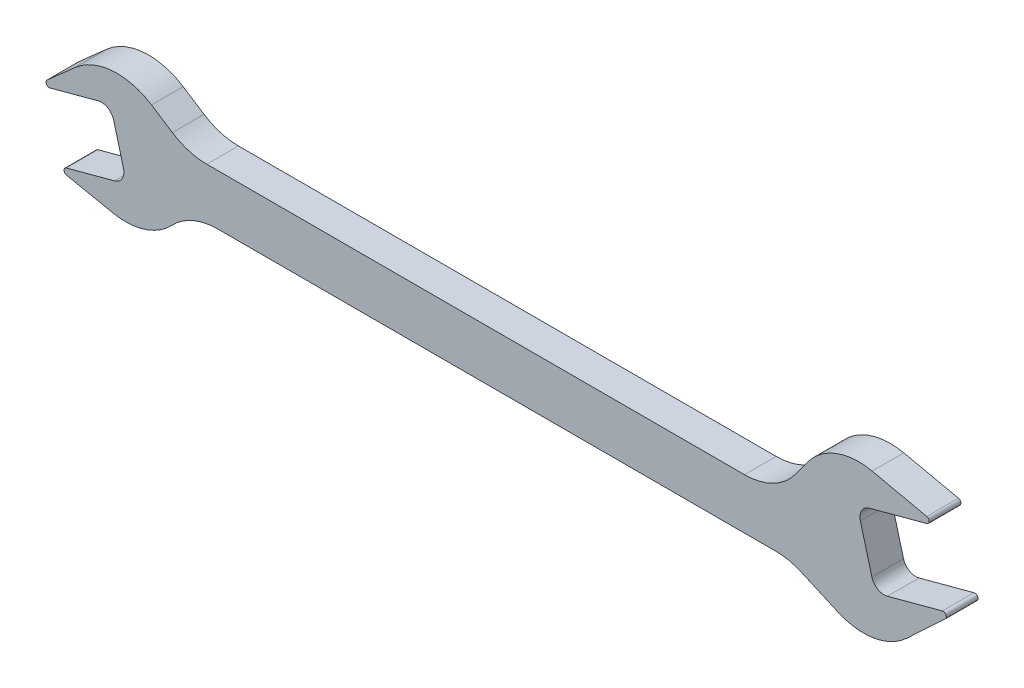
ISO-10303-21;
HEADER;
FILE_DESCRIPTION(('STEP AP214'),'2;1');
FILE_NAME('part.step','',(''),(''),'','','');
FILE_SCHEMA(('AUTOMOTIVE_DESIGN { 1 0 10303 214 1 1 1 1 }'));
ENDSEC;
DATA;
#1=APPLICATION_CONTEXT('core data for automotive mechanical design processes');
#2=APPLICATION_PROTOCOL_DEFINITION('international standard','automotive_design',2000,#1);
#3=PRODUCT_CONTEXT('',#1,'mechanical');
#4=PRODUCT('Part','Part','',(#3));
#5=PRODUCT_RELATED_PRODUCT_CATEGORY('part','',(#4));
#6=PRODUCT_DEFINITION_FORMATION('','',#4);
#7=PRODUCT_DEFINITION_CONTEXT('part definition',#1,'design');
#8=PRODUCT_DEFINITION('design','',#6,#7);
#9=PRODUCT_DEFINITION_SHAPE('','',#8);
#10=(LENGTH_UNIT() NAMED_UNIT(*) SI_UNIT(.MILLI.,.METRE.));
#11=(NAMED_UNIT(*) PLANE_ANGLE_UNIT() SI_UNIT($,.RADIAN.));
#12=(NAMED_UNIT(*) SI_UNIT($,.STERADIAN.) SOLID_ANGLE_UNIT());
#13=UNCERTAINTY_MEASURE_WITH_UNIT(LENGTH_MEASURE(1.E-05),#10,'distance_accuracy_value','');
#14=(GEOMETRIC_REPRESENTATION_CONTEXT(3) GLOBAL_UNCERTAINTY_ASSIGNED_CONTEXT((#13)) GLOBAL_UNIT_ASSIGNED_CONTEXT((#10,
#11,#12)) REPRESENTATION_CONTEXT('',''));
#15=CARTESIAN_POINT('',(0.,0.,0.));
#16=DIRECTION('',(0.,0.,1.));
#17=DIRECTION('',(1.,0.,0.));
#18=AXIS2_PLACEMENT_3D('',#15,#16,#17);
#19=CARTESIAN_POINT('',(55.2111783674086,14.4703050229545,2.5));
#20=DIRECTION('',(-0.2138427095795,-0.976868105508465,0.));
#21=DIRECTION('',(0.976868105508465,-0.2138427095795,0.));
#22=AXIS2_PLACEMENT_3D('',#19,#20,#21);
#23=PLANE('',#22);
#24=DIRECTION('',(-0.976868105508465,0.2138427095795,0.));
#25=VECTOR('',#24,1.);
#26=CARTESIAN_POINT('',(55.2111783674086,14.4703050229545,2.5));
#27=LINE('',#26,#25);
#28=CARTESIAN_POINT('',(70.2151887025051,11.1858306844809,2.5));
#29=VERTEX_POINT('',#28);
#30=CARTESIAN_POINT('',(61.5967530172565,13.0724616727154,2.5));
#31=VERTEX_POINT('',#30);
#32=EDGE_CURVE('E481',#29,#31,#27,.T.);
#33=ORIENTED_EDGE('',*,*,#32,.F.);
#34=DIRECTION('',(0.,0.,-1.));
#35=VECTOR('',#34,1.);
#36=CARTESIAN_POINT('',(70.2151887025051,11.1858306844809,2.5));
#37=LINE('',#36,#35);
#38=CARTESIAN_POINT('',(70.2151887025051,11.1858306844809,-2.5));
#39=VERTEX_POINT('',#38);
#40=EDGE_CURVE('E358',#29,#39,#37,.T.);
#41=ORIENTED_EDGE('',*,*,#40,.T.);
#42=DIRECTION('',(-0.976868105508465,0.2138427095795,0.));
#43=VECTOR('',#42,1.);
#44=CARTESIAN_POINT('',(55.2111783674086,14.4703050229545,-2.5));
#45=LINE('',#44,#43);
#46=CARTESIAN_POINT('',(61.5967530172565,13.0724616727154,-2.5));
#47=VERTEX_POINT('',#46);
#48=EDGE_CURVE('E452',#39,#47,#45,.T.);
#49=ORIENTED_EDGE('',*,*,#48,.T.);
#50=DIRECTION('',(0.,0.,-1.));
#51=VECTOR('',#50,1.);
#52=CARTESIAN_POINT('',(61.5967530172565,13.0724616727154,2.5));
#53=LINE('',#52,#51);
#54=EDGE_CURVE('E294',#47,#31,#53,.F.);
#55=ORIENTED_EDGE('',*,*,#54,.T.);
#56=EDGE_LOOP('',(#33,#41,#49,#55));
#57=FACE_BOUND('',#56,.T.);
#58=ADVANCED_FACE('F34',(#57),#23,.F.);
#59=CARTESIAN_POINT('',(46.5129358567475,2.5,2.5));
#60=DIRECTION('',(0.808974994362871,-0.587843056006952,0.));
#61=DIRECTION('',(0.587843056006953,0.808974994362871,0.));
#62=AXIS2_PLACEMENT_3D('',#59,#60,#61);
#63=PLANE('',#62);
#64=DIRECTION('',(-0.587843056006952,-0.808974994362871,0.));
#65=VECTOR('',#64,1.);
#66=CARTESIAN_POINT('',(46.5129358567475,2.5,-2.5));
#67=LINE('',#66,#65);
#68=CARTESIAN_POINT('',(51.3685759778328,9.18221117770026,-2.5));
#69=VERTEX_POINT('',#68);
#70=CARTESIAN_POINT('',(49.5078813025233,6.62156943993047,-2.5));
#71=VERTEX_POINT('',#70);
#72=EDGE_CURVE('E410',#69,#71,#67,.T.);
#73=ORIENTED_EDGE('',*,*,#72,.T.);
#74=DIRECTION('',(0.,0.,-1.));
#75=VECTOR('',#74,1.);
#76=CARTESIAN_POINT('',(49.5078813025233,6.62156943993047,2.5));
#77=LINE('',#76,#75);
#78=CARTESIAN_POINT('',(49.5078813025233,6.62156943993047,2.5));
#79=VERTEX_POINT('',#78);
#80=EDGE_CURVE('E376',#71,#79,#77,.F.);
#81=ORIENTED_EDGE('',*,*,#80,.T.);
#82=DIRECTION('',(-0.587843056006952,-0.808974994362871,0.));
#83=VECTOR('',#82,1.);
#84=CARTESIAN_POINT('',(46.5129358567475,2.5,2.5));
#85=LINE('',#84,#83);
#86=CARTESIAN_POINT('',(51.3685759778328,9.18221117770026,2.5));
#87=VERTEX_POINT('',#86);
#88=EDGE_CURVE('E423',#87,#79,#85,.T.);
#89=ORIENTED_EDGE('',*,*,#88,.F.);
#90=DIRECTION('',(0.,0.,-1.));
#91=VECTOR('',#90,1.);
#92=CARTESIAN_POINT('',(51.3685759778328,9.18221117770026,2.5));
#93=LINE('',#92,#91);
#94=EDGE_CURVE('E291',#87,#69,#93,.T.);
#95=ORIENTED_EDGE('',*,*,#94,.T.);
#96=EDGE_LOOP('',(#73,#81,#89,#95));
#97=FACE_BOUND('',#96,.T.);
#98=ADVANCED_FACE('F592',(#97),#63,.F.);
#99=CARTESIAN_POINT('',(-46.5129358567475,2.5,2.5));
#100=DIRECTION('',(0.,-1.,0.));
#101=DIRECTION('',(1.,0.,0.));
#102=AXIS2_PLACEMENT_3D('',#99,#100,#101);
#103=PLANE('',#102);
#104=DIRECTION('',(-1.,0.,0.));
#105=VECTOR('',#104,1.);
#106=CARTESIAN_POINT('',(-46.5129358567475,2.5,2.5));
#107=LINE('',#106,#105);
#108=CARTESIAN_POINT('',(41.4181313588946,2.5,2.5));
#109=VERTEX_POINT('',#108);
#110=CARTESIAN_POINT('',(-43.5541639535835,2.5,2.5));
#111=VERTEX_POINT('',#110);
#112=EDGE_CURVE('E418',#109,#111,#107,.T.);
#113=ORIENTED_EDGE('',*,*,#112,.F.);
#114=DIRECTION('',(0.,0.,-1.));
#115=VECTOR('',#114,1.);
#116=CARTESIAN_POINT('',(41.4181313588946,2.5,-2.5));
#117=LINE('',#116,#115);
#118=CARTESIAN_POINT('',(41.4181313588946,2.5,-2.5));
#119=VERTEX_POINT('',#118);
#120=EDGE_CURVE('E373',#109,#119,#117,.T.);
#121=ORIENTED_EDGE('',*,*,#120,.T.);
#122=DIRECTION('',(-1.,0.,0.));
#123=VECTOR('',#122,1.);
#124=CARTESIAN_POINT('',(-46.5129358567475,2.5,-2.5));
#125=LINE('',#124,#123);
#126=CARTESIAN_POINT('',(-43.5541639535835,2.5,-2.5));
#127=VERTEX_POINT('',#126);
#128=EDGE_CURVE('E403',#119,#127,#125,.T.);
#129=ORIENTED_EDGE('',*,*,#128,.T.);
#130=DIRECTION('',(0.,0.,-1.));
#131=VECTOR('',#130,1.);
#132=CARTESIAN_POINT('',(-43.5541639535835,2.5,2.5));
#133=LINE('',#132,#131);
#134=EDGE_CURVE('E371',#127,#111,#133,.F.);
#135=ORIENTED_EDGE('',*,*,#134,.T.);
#136=EDGE_LOOP('',(#113,#121,#129,#135));
#137=FACE_BOUND('',#136,.T.);
#138=ADVANCED_FACE('F408',(#137),#103,.F.);
#139=CARTESIAN_POINT('',(-46.5129358567475,2.5,2.5));
#140=DIRECTION('',(-0.544120288580365,-0.839007217820694,0.));
#141=DIRECTION('',(0.839007217820694,-0.544120288580365,0.));
#142=AXIS2_PLACEMENT_3D('',#139,#140,#141);
#143=PLANE('',#142);
#144=DIRECTION('',(-0.839007217820694,0.544120288580365,0.));
#145=VECTOR('',#144,1.);
#146=CARTESIAN_POINT('',(-46.5129358567475,2.5,2.5));
#147=LINE('',#146,#145);
#148=CARTESIAN_POINT('',(-48.9953668393871,4.10992782179306,2.5));
#149=VERTEX_POINT('',#148);
#150=CARTESIAN_POINT('',(-52.287761740234,6.24514051784425,2.5));
#151=VERTEX_POINT('',#150);
#152=EDGE_CURVE('E414',#149,#151,#147,.T.);
#153=ORIENTED_EDGE('',*,*,#152,.F.);
#154=DIRECTION('',(0.,0.,-1.));
#155=VECTOR('',#154,1.);
#156=CARTESIAN_POINT('',(-48.9953668393871,4.10992782179306,-2.5));
#157=LINE('',#156,#155);
#158=CARTESIAN_POINT('',(-48.9953668393871,4.10992782179306,-2.5));
#159=VERTEX_POINT('',#158);
#160=EDGE_CURVE('E388',#149,#159,#157,.T.);
#161=ORIENTED_EDGE('',*,*,#160,.T.);
#162=DIRECTION('',(-0.839007217820694,0.544120288580365,0.));
#163=VECTOR('',#162,1.);
#164=CARTESIAN_POINT('',(-46.5129358567475,2.5,-2.5));
#165=LINE('',#164,#163);
#166=CARTESIAN_POINT('',(-52.287761740234,6.24514051784425,-2.5));
#167=VERTEX_POINT('',#166);
#168=EDGE_CURVE('E405',#159,#167,#165,.T.);
#169=ORIENTED_EDGE('',*,*,#168,.T.);
#170=DIRECTION('',(0.,0.,-1.));
#171=VECTOR('',#170,1.);
#172=CARTESIAN_POINT('',(-52.287761740234,6.24514051784425,2.5));
#173=LINE('',#172,#171);
#174=EDGE_CURVE('E272',#167,#151,#173,.F.);
#175=ORIENTED_EDGE('',*,*,#174,.T.);
#176=EDGE_LOOP('',(#153,#161,#169,#175));
#177=FACE_BOUND('',#176,.T.);
#178=ADVANCED_FACE('F413',(#177),#143,.F.);
#179=CARTESIAN_POINT('',(-58.6711441289778,10.3849474154583,2.5));
#180=DIRECTION('',(0.6634699532493,-0.748202927777867,0.));
#181=DIRECTION('',(0.748202927777867,0.6634699532493,0.));
#182=AXIS2_PLACEMENT_3D('',#179,#180,#181);
#183=PLANE('',#182);
#184=DIRECTION('',(-0.748202927777867,-0.6634699532493,0.));
#185=VECTOR('',#184,1.);
#186=CARTESIAN_POINT('',(-58.6711441289778,10.3849474154583,-2.5));
#187=LINE('',#186,#185);
#188=CARTESIAN_POINT('',(-64.3636641585307,5.33709761741599,-2.5));
#189=VERTEX_POINT('',#188);
#190=CARTESIAN_POINT('',(-68.7976531497918,1.40525191149631,-2.5));
#191=VERTEX_POINT('',#190);
#192=EDGE_CURVE('E457',#189,#191,#187,.T.);
#193=ORIENTED_EDGE('',*,*,#192,.T.);
#194=DIRECTION('',(0.,0.,-1.));
#195=VECTOR('',#194,1.);
#196=CARTESIAN_POINT('',(-68.7976531497918,1.40525191149631,2.5));
#197=LINE('',#196,#195);
#198=CARTESIAN_POINT('',(-68.7976531497918,1.40525191149631,2.5));
#199=VERTEX_POINT('',#198);
#200=EDGE_CURVE('E369',#191,#199,#197,.F.);
#201=ORIENTED_EDGE('',*,*,#200,.T.);
#202=DIRECTION('',(-0.748202927777867,-0.6634699532493,0.));
#203=VECTOR('',#202,1.);
#204=CARTESIAN_POINT('',(-58.6711441289778,10.3849474154583,2.5));
#205=LINE('',#204,#203);
#206=CARTESIAN_POINT('',(-64.3636641585307,5.33709761741599,2.5));
#207=VERTEX_POINT('',#206);
#208=EDGE_CURVE('E417',#207,#199,#205,.T.);
#209=ORIENTED_EDGE('',*,*,#208,.F.);
#210=DIRECTION('',(0.,0.,-1.));
#211=VECTOR('',#210,1.);
#212=CARTESIAN_POINT('',(-64.3636641585307,5.33709761741599,2.5));
#213=LINE('',#212,#211);
#214=EDGE_CURVE('E269',#207,#189,#213,.T.);
#215=ORIENTED_EDGE('',*,*,#214,.T.);
#216=EDGE_LOOP('',(#193,#201,#209,#215));
#217=FACE_BOUND('',#216,.T.);
#218=ADVANCED_FACE('F490',(#217),#183,.F.);
#219=CARTESIAN_POINT('',(-70.3823723813075,0.,2.5));
#220=DIRECTION('',(-0.258819045102481,0.965925826289079,0.));
#221=DIRECTION('',(-0.965925826289079,-0.258819045102481,0.));
#222=AXIS2_PLACEMENT_3D('',#219,#220,#221);
#223=PLANE('',#222);
#224=DIRECTION('',(0.965925826289079,0.258819045102481,0.));
#225=VECTOR('',#224,1.);
#226=CARTESIAN_POINT('',(-70.3823723813075,0.,2.5));
#227=LINE('',#226,#225);
#228=CARTESIAN_POINT('',(-68.3365086506159,0.548187534462839,2.5));
#229=VERTEX_POINT('',#228);
#230=CARTESIAN_POINT('',(-60.7231141184167,2.5881904510248,2.5));
#231=VERTEX_POINT('',#230);
#232=EDGE_CURVE('E421',#229,#231,#227,.T.);
#233=ORIENTED_EDGE('',*,*,#232,.F.);
#234=DIRECTION('',(0.,0.,-1.));
#235=VECTOR('',#234,1.);
#236=CARTESIAN_POINT('',(-68.3365086506159,0.548187534462839,2.5));
#237=LINE('',#236,#235);
#238=CARTESIAN_POINT('',(-68.3365086506159,0.548187534462839,-2.5));
#239=VERTEX_POINT('',#238);
#240=EDGE_CURVE('E366',#229,#239,#237,.T.);
#241=ORIENTED_EDGE('',*,*,#240,.T.);
#242=DIRECTION('',(0.965925826289079,0.258819045102481,0.));
#243=VECTOR('',#242,1.);
#244=CARTESIAN_POINT('',(-70.3823723813075,0.,-2.5));
#245=LINE('',#244,#243);
#246=CARTESIAN_POINT('',(-60.7231141184167,2.5881904510248,-2.5));
#247=VERTEX_POINT('',#246);
#248=EDGE_CURVE('E460',#239,#247,#245,.T.);
#249=ORIENTED_EDGE('',*,*,#248,.T.);
#250=DIRECTION('',(0.,0.,-1.));
#251=VECTOR('',#250,1.);
#252=CARTESIAN_POINT('',(-60.7231141184167,2.5881904510248,2.5));
#253=LINE('',#252,#251);
#254=EDGE_CURVE('E316',#247,#231,#253,.F.);
#255=ORIENTED_EDGE('',*,*,#254,.T.);
#256=EDGE_LOOP('',(#233,#241,#249,#255));
#257=FACE_BOUND('',#256,.T.);
#258=ADVANCED_FACE('F497',(#257),#223,.F.);
#259=CARTESIAN_POINT('',(-58.7912624658386,3.10582854122976,2.5));
#260=DIRECTION('',(0.965925826289079,0.258819045102481,0.));
#261=DIRECTION('',(-0.258819045102481,0.965925826289079,0.));
#262=AXIS2_PLACEMENT_3D('',#259,#260,#261);
#263=PLANE('',#262);
#264=DIRECTION('',(0.258819045102481,-0.965925826289079,0.));
#265=VECTOR('',#264,1.);
#266=CARTESIAN_POINT('',(-58.7912624658386,3.10582854122976,-2.5));
#267=LINE('',#266,#265);
#268=CARTESIAN_POINT('',(-58.2736243756336,1.1739768886516,-2.5));
#269=VERTEX_POINT('',#268);
#270=CARTESIAN_POINT('',(-56.7207101050187,-4.62157806908287,-2.5));
#271=VERTEX_POINT('',#270);
#272=EDGE_CURVE('E462',#269,#271,#267,.T.);
#273=ORIENTED_EDGE('',*,*,#272,.T.);
#274=DIRECTION('',(0.,0.,-1.));
#275=VECTOR('',#274,1.);
#276=CARTESIAN_POINT('',(-56.7207101050187,-4.62157806908287,2.5));
#277=LINE('',#276,#275);
#278=CARTESIAN_POINT('',(-56.7207101050187,-4.62157806908287,2.5));
#279=VERTEX_POINT('',#278);
#280=EDGE_CURVE('E314',#271,#279,#277,.F.);
#281=ORIENTED_EDGE('',*,*,#280,.T.);
#282=DIRECTION('',(0.258819045102481,-0.965925826289079,0.));
#283=VECTOR('',#282,1.);
#284=CARTESIAN_POINT('',(-58.7912624658386,3.10582854122976,2.5));
#285=LINE('',#284,#283);
#286=CARTESIAN_POINT('',(-58.2736243756336,1.1739768886516,2.5));
#287=VERTEX_POINT('',#286);
#288=EDGE_CURVE('E428',#287,#279,#285,.T.);
#289=ORIENTED_EDGE('',*,*,#288,.F.);
#290=DIRECTION('',(0.,0.,-1.));
#291=VECTOR('',#290,1.);
#292=CARTESIAN_POINT('',(-58.2736243756336,1.17397688865161,-2.5));
#293=LINE('',#292,#291);
#294=EDGE_CURVE('E311',#287,#269,#293,.T.);
#295=ORIENTED_EDGE('',*,*,#294,.T.);
#296=EDGE_LOOP('',(#273,#281,#289,#295));
#297=FACE_BOUND('',#296,.T.);
#298=ADVANCED_FACE('F507',(#297),#263,.F.);
#299=CARTESIAN_POINT('',(-56.2030720148138,-6.55342972166103,2.5));
#300=DIRECTION('',(0.25881904510248,-0.965925826289079,0.));
#301=DIRECTION('',(0.965925826289079,0.25881904510248,0.));
#302=AXIS2_PLACEMENT_3D('',#299,#300,#301);
#303=PLANE('',#302);
#304=DIRECTION('',(-0.965925826289079,-0.25881904510248,0.));
#305=VECTOR('',#304,1.);
#306=CARTESIAN_POINT('',(-56.2030720148138,-6.55342972166103,-2.5));
#307=LINE('',#306,#305);
#308=CARTESIAN_POINT('',(-58.1349236673919,-7.07106781186599,-2.5));
#309=VERTEX_POINT('',#308);
#310=CARTESIAN_POINT('',(-65.7483181995911,-9.11107072842795,-2.5));
#311=VERTEX_POINT('',#310);
#312=EDGE_CURVE('E258',#309,#311,#307,.T.);
#313=ORIENTED_EDGE('',*,*,#312,.T.);
#314=DIRECTION('',(0.,0.,-1.));
#315=VECTOR('',#314,1.);
#316=CARTESIAN_POINT('',(-65.7483181995911,-9.11107072842795,2.5));
#317=LINE('',#316,#315);
#318=CARTESIAN_POINT('',(-65.7483181995911,-9.11107072842795,2.5));
#319=VERTEX_POINT('',#318);
#320=EDGE_CURVE('E364',#311,#319,#317,.F.);
#321=ORIENTED_EDGE('',*,*,#320,.T.);
#322=DIRECTION('',(-0.965925826289079,-0.25881904510248,0.));
#323=VECTOR('',#322,1.);
#324=CARTESIAN_POINT('',(-56.2030720148138,-6.55342972166103,2.5));
#325=LINE('',#324,#323);
#326=CARTESIAN_POINT('',(-58.1349236673919,-7.07106781186599,2.5));
#327=VERTEX_POINT('',#326);
#328=EDGE_CURVE('E431',#327,#319,#325,.T.);
#329=ORIENTED_EDGE('',*,*,#328,.F.);
#330=DIRECTION('',(0.,0.,-1.));
#331=VECTOR('',#330,1.);
#332=CARTESIAN_POINT('',(-58.1349236673919,-7.07106781186599,-2.5));
#333=LINE('',#332,#331);
#334=EDGE_CURVE('E308',#327,#309,#333,.T.);
#335=ORIENTED_EDGE('',*,*,#334,.T.);
#336=EDGE_LOOP('',(#313,#321,#329,#335));
#337=FACE_BOUND('',#336,.T.);
#338=ADVANCED_FACE('F516',(#337),#303,.F.);
#339=CARTESIAN_POINT('',(-67.7941819302827,-9.65925826289079,2.5));
#340=DIRECTION('',(0.200480370272716,0.97969771926616,0.));
#341=DIRECTION('',(-0.97969771926616,0.200480370272716,0.));
#342=AXIS2_PLACEMENT_3D('',#339,#340,#341);
#343=PLANE('',#342);
#344=DIRECTION('',(0.979697719266159,-0.200480370272716,0.));
#345=VECTOR('',#344,1.);
#346=CARTESIAN_POINT('',(-67.7941819302827,-9.65925826289079,2.5));
#347=LINE('',#346,#345);
#348=CARTESIAN_POINT('',(-65.7191488621762,-10.0838825012056,2.5));
#349=VERTEX_POINT('',#348);
#350=CARTESIAN_POINT('',(-58.3913967971921,-11.5833965026826,2.5));
#351=VERTEX_POINT('',#350);
#352=EDGE_CURVE('E434',#349,#351,#347,.T.);
#353=ORIENTED_EDGE('',*,*,#352,.F.);
#354=DIRECTION('',(0.,0.,-1.));
#355=VECTOR('',#354,1.);
#356=CARTESIAN_POINT('',(-65.7191488621762,-10.0838825012056,2.5));
#357=LINE('',#356,#355);
#358=CARTESIAN_POINT('',(-65.7191488621762,-10.0838825012056,-2.5));
#359=VERTEX_POINT('',#358);
#360=EDGE_CURVE('E256',#349,#359,#357,.T.);
#361=ORIENTED_EDGE('',*,*,#360,.T.);
#362=DIRECTION('',(0.979697719266159,-0.200480370272716,0.));
#363=VECTOR('',#362,1.);
#364=CARTESIAN_POINT('',(-67.7941819302827,-9.65925826289079,-2.5));
#365=LINE('',#364,#363);
#366=CARTESIAN_POINT('',(-58.3913967971921,-11.5833965026826,-2.5));
#367=VERTEX_POINT('',#366);
#368=EDGE_CURVE('E240',#359,#367,#365,.T.);
#369=ORIENTED_EDGE('',*,*,#368,.T.);
#370=DIRECTION('',(0.,0.,-1.));
#371=VECTOR('',#370,1.);
#372=CARTESIAN_POINT('',(-58.3913967971921,-11.5833965026826,2.5));
#373=LINE('',#372,#371);
#374=EDGE_CURVE('E246',#367,#351,#373,.F.);
#375=ORIENTED_EDGE('',*,*,#374,.T.);
#376=EDGE_LOOP('',(#353,#361,#369,#375));
#377=FACE_BOUND('',#376,.T.);
#378=ADVANCED_FACE('F253',(#377),#343,.F.);
#379=CARTESIAN_POINT('',(-46.5129358567475,-5.5,2.5));
#380=DIRECTION('',(0.,1.,0.));
#381=DIRECTION('',(0.,0.,1.));
#382=AXIS2_PLACEMENT_3D('',#379,#380,#381);
#383=PLANE('',#382);
#384=DIRECTION('',(1.,0.,0.));
#385=VECTOR('',#384,1.);
#386=CARTESIAN_POINT('',(-46.5129358567475,-5.5,-2.5));
#387=LINE('',#386,#385);
#388=CARTESIAN_POINT('',(-41.828512703856,-5.5,-2.5));
#389=VERTEX_POINT('',#388);
#390=CARTESIAN_POINT('',(46.3488676118916,-5.5,-2.5));
#391=VERTEX_POINT('',#390);
#392=EDGE_CURVE('E257',#389,#391,#387,.T.);
#393=ORIENTED_EDGE('',*,*,#392,.T.);
#394=DIRECTION('',(0.,0.,-1.));
#395=VECTOR('',#394,1.);
#396=CARTESIAN_POINT('',(46.3488676118916,-5.5,2.5));
#397=LINE('',#396,#395);
#398=CARTESIAN_POINT('',(46.3488676118916,-5.5,2.5));
#399=VERTEX_POINT('',#398);
#400=EDGE_CURVE('E384',#391,#399,#397,.F.);
#401=ORIENTED_EDGE('',*,*,#400,.T.);
#402=DIRECTION('',(1.,0.,0.));
#403=VECTOR('',#402,1.);
#404=CARTESIAN_POINT('',(-46.5129358567475,-5.5,2.5));
#405=LINE('',#404,#403);
#406=CARTESIAN_POINT('',(-41.828512703856,-5.5,2.5));
#407=VERTEX_POINT('',#406);
#408=EDGE_CURVE('E436',#407,#399,#405,.T.);
#409=ORIENTED_EDGE('',*,*,#408,.F.);
#410=DIRECTION('',(0.,0.,-1.));
#411=VECTOR('',#410,1.);
#412=CARTESIAN_POINT('',(-41.828512703856,-5.5,2.5));
#413=LINE('',#412,#411);
#414=EDGE_CURVE('E381',#407,#389,#413,.T.);
#415=ORIENTED_EDGE('',*,*,#414,.T.);
#416=EDGE_LOOP('',(#393,#401,#409,#415));
#417=FACE_BOUND('',#416,.T.);
#418=ADVANCED_FACE('F527',(#417),#383,.F.);
#419=CARTESIAN_POINT('',(62.1992925851766,-11.6096922868504,2.5));
#420=DIRECTION('',(0.406671368141142,0.913574517121735,0.));
#421=DIRECTION('',(-0.913574517121735,0.406671368141142,0.));
#422=AXIS2_PLACEMENT_3D('',#419,#420,#421);
#423=PLANE('',#422);
#424=DIRECTION('',(0.913574517121735,-0.406671368141142,0.));
#425=VECTOR('',#424,1.);
#426=CARTESIAN_POINT('',(62.1992925851766,-11.6096922868504,2.5));
#427=LINE('',#426,#425);
#428=CARTESIAN_POINT('',(50.415581293303,-6.36425482878265,2.5));
#429=VERTEX_POINT('',#428);
#430=CARTESIAN_POINT('',(56.1446303243626,-8.91450132093414,2.5));
#431=VERTEX_POINT('',#430);
#432=EDGE_CURVE('E439',#429,#431,#427,.T.);
#433=ORIENTED_EDGE('',*,*,#432,.F.);
#434=DIRECTION('',(0.,0.,-1.));
#435=VECTOR('',#434,1.);
#436=CARTESIAN_POINT('',(50.415581293303,-6.36425482878265,-2.5));
#437=LINE('',#436,#435);
#438=CARTESIAN_POINT('',(50.415581293303,-6.36425482878265,-2.5));
#439=VERTEX_POINT('',#438);
#440=EDGE_CURVE('E378',#429,#439,#437,.T.);
#441=ORIENTED_EDGE('',*,*,#440,.T.);
#442=DIRECTION('',(0.913574517121735,-0.406671368141142,0.));
#443=VECTOR('',#442,1.);
#444=CARTESIAN_POINT('',(62.1992925851766,-11.6096922868504,-2.5));
#445=LINE('',#444,#443);
#446=CARTESIAN_POINT('',(56.1446303243626,-8.91450132093414,-2.5));
#447=VERTEX_POINT('',#446);
#448=EDGE_CURVE('E469',#439,#447,#445,.T.);
#449=ORIENTED_EDGE('',*,*,#448,.T.);
#450=DIRECTION('',(0.,0.,-1.));
#451=VECTOR('',#450,1.);
#452=CARTESIAN_POINT('',(56.1446303243626,-8.91450132093414,2.5));
#453=LINE('',#452,#451);
#454=EDGE_CURVE('E284',#447,#431,#453,.F.);
#455=ORIENTED_EDGE('',*,*,#454,.T.);
#456=EDGE_LOOP('',(#433,#441,#449,#455));
#457=FACE_BOUND('',#456,.T.);
#458=ADVANCED_FACE('F536',(#457),#423,.F.);
#459=CARTESIAN_POINT('',(74.6176276186925,0.,2.5));
#460=DIRECTION('',(-0.682923075697081,0.730490296089167,0.));
#461=DIRECTION('',(-0.730490296089167,-0.682923075697081,0.));
#462=AXIS2_PLACEMENT_3D('',#459,#460,#461);
#463=PLANE('',#462);
#464=DIRECTION('',(0.730490296089167,0.682923075697081,0.));
#465=VECTOR('',#464,1.);
#466=CARTESIAN_POINT('',(74.6176276186925,0.,-2.5));
#467=LINE('',#466,#465);
#468=CARTESIAN_POINT('',(67.0405747627448,-7.08365911060846,-2.5));
#469=VERTEX_POINT('',#468);
#470=CARTESIAN_POINT('',(73.1566470265142,-1.36584615139416,-2.5));
#471=VERTEX_POINT('',#470);
#472=EDGE_CURVE('E471',#469,#471,#467,.T.);
#473=ORIENTED_EDGE('',*,*,#472,.T.);
#474=DIRECTION('',(0.,0.,-1.));
#475=VECTOR('',#474,1.);
#476=CARTESIAN_POINT('',(73.1566470265142,-1.36584615139416,2.5));
#477=LINE('',#476,#475);
#478=CARTESIAN_POINT('',(73.1566470265142,-1.36584615139416,2.5));
#479=VERTEX_POINT('',#478);
#480=EDGE_CURVE('E348',#471,#479,#477,.F.);
#481=ORIENTED_EDGE('',*,*,#480,.T.);
#482=DIRECTION('',(0.730490296089167,0.682923075697081,0.));
#483=VECTOR('',#482,1.);
#484=CARTESIAN_POINT('',(74.6176276186925,0.,2.5));
#485=LINE('',#484,#483);
#486=CARTESIAN_POINT('',(67.0405747627448,-7.08365911060846,2.5));
#487=VERTEX_POINT('',#486);
#488=EDGE_CURVE('E441',#487,#479,#485,.T.);
#489=ORIENTED_EDGE('',*,*,#488,.F.);
#490=DIRECTION('',(0.,0.,-1.));
#491=VECTOR('',#490,1.);
#492=CARTESIAN_POINT('',(67.0405747627448,-7.08365911060846,2.5));
#493=LINE('',#492,#491);
#494=EDGE_CURVE('E275',#487,#469,#493,.T.);
#495=ORIENTED_EDGE('',*,*,#494,.T.);
#496=EDGE_LOOP('',(#473,#481,#489,#495));
#497=FACE_BOUND('',#496,.T.);
#498=ADVANCED_FACE('F544',(#497),#463,.F.);
#499=CARTESIAN_POINT('',(62.0605918769346,-3.36464758633278,2.5));
#500=DIRECTION('',(0.258819045102522,-0.965925826289068,0.));
#501=DIRECTION('',(0.965925826289068,0.258819045102522,0.));
#502=AXIS2_PLACEMENT_3D('',#499,#500,#501);
#503=PLANE('',#502);
#504=DIRECTION('',(-0.965925826289068,-0.258819045102522,0.));
#505=VECTOR('',#504,1.);
#506=CARTESIAN_POINT('',(62.0605918769346,-3.36464758633278,2.5));
#507=LINE('',#506,#505);
#508=CARTESIAN_POINT('',(72.6857759661143,-0.517638090205041,2.5));
#509=VERTEX_POINT('',#508);
#510=CARTESIAN_POINT('',(63.9924435295127,-2.84700949612774,2.5));
#511=VERTEX_POINT('',#510);
#512=EDGE_CURVE('E444',#509,#511,#507,.T.);
#513=ORIENTED_EDGE('',*,*,#512,.F.);
#514=DIRECTION('',(0.,0.,-1.));
#515=VECTOR('',#514,1.);
#516=CARTESIAN_POINT('',(72.6857759661143,-0.51763809020504,2.5));
#517=LINE('',#516,#515);
#518=CARTESIAN_POINT('',(72.6857759661143,-0.517638090205041,-2.5));
#519=VERTEX_POINT('',#518);
#520=EDGE_CURVE('E337',#509,#519,#517,.T.);
#521=ORIENTED_EDGE('',*,*,#520,.T.);
#522=DIRECTION('',(-0.965925826289068,-0.258819045102522,0.));
#523=VECTOR('',#522,1.);
#524=CARTESIAN_POINT('',(62.0605918769346,-3.36464758633278,-2.5));
#525=LINE('',#524,#523);
#526=CARTESIAN_POINT('',(63.9924435295127,-2.84700949612774,-2.5));
#527=VERTEX_POINT('',#526);
#528=EDGE_CURVE('E474',#519,#527,#525,.T.);
#529=ORIENTED_EDGE('',*,*,#528,.T.);
#530=DIRECTION('',(0.,0.,-1.));
#531=VECTOR('',#530,1.);
#532=CARTESIAN_POINT('',(63.9924435295127,-2.84700949612774,2.5));
#533=LINE('',#532,#531);
#534=EDGE_CURVE('E302',#527,#511,#533,.F.);
#535=ORIENTED_EDGE('',*,*,#534,.T.);
#536=EDGE_LOOP('',(#513,#521,#529,#535));
#537=FACE_BOUND('',#536,.T.);
#538=ADVANCED_FACE('F553',(#537),#503,.F.);
#539=CARTESIAN_POINT('',(59.2135823808069,7.26053650284698,2.5));
#540=DIRECTION('',(-0.965925826289068,-0.258819045102522,0.));
#541=DIRECTION('',(0.258819045102522,-0.965925826289068,0.));
#542=AXIS2_PLACEMENT_3D('',#539,#540,#541);
#543=PLANE('',#542);
#544=DIRECTION('',(-0.258819045102522,0.965925826289068,0.));
#545=VECTOR('',#544,1.);
#546=CARTESIAN_POINT('',(59.2135823808069,7.26053650284698,2.5));
#547=LINE('',#546,#545);
#548=CARTESIAN_POINT('',(61.5429537867296,-1.43279593375465,2.5));
#549=VERTEX_POINT('',#548);
#550=CARTESIAN_POINT('',(59.7312204710119,5.32868485026884,2.5));
#551=VERTEX_POINT('',#550);
#552=EDGE_CURVE('E446',#549,#551,#547,.T.);
#553=ORIENTED_EDGE('',*,*,#552,.F.);
#554=DIRECTION('',(0.,0.,-1.));
#555=VECTOR('',#554,1.);
#556=CARTESIAN_POINT('',(61.5429537867296,-1.43279593375464,-2.5));
#557=LINE('',#556,#555);
#558=CARTESIAN_POINT('',(61.5429537867296,-1.43279593375465,-2.5));
#559=VERTEX_POINT('',#558);
#560=EDGE_CURVE('E299',#549,#559,#557,.T.);
#561=ORIENTED_EDGE('',*,*,#560,.T.);
#562=DIRECTION('',(-0.258819045102522,0.965925826289068,0.));
#563=VECTOR('',#562,1.);
#564=CARTESIAN_POINT('',(59.2135823808069,7.26053650284698,-2.5));
#565=LINE('',#564,#563);
#566=CARTESIAN_POINT('',(59.7312204710119,5.32868485026884,-2.5));
#567=VERTEX_POINT('',#566);
#568=EDGE_CURVE('E476',#559,#567,#565,.T.);
#569=ORIENTED_EDGE('',*,*,#568,.T.);
#570=DIRECTION('',(0.,0.,-1.));
#571=VECTOR('',#570,1.);
#572=CARTESIAN_POINT('',(59.7312204710119,5.32868485026884,2.5));
#573=LINE('',#572,#571);
#574=EDGE_CURVE('E297',#567,#551,#573,.F.);
#575=ORIENTED_EDGE('',*,*,#574,.T.);
#576=EDGE_LOOP('',(#553,#561,#569,#575));
#577=FACE_BOUND('',#576,.T.);
#578=ADVANCED_FACE('F562',(#577),#543,.F.);
#579=CARTESIAN_POINT('',(72.2228119222272,10.7463490526217,2.5));
#580=DIRECTION('',(-0.258819045102521,0.965925826289068,0.));
#581=DIRECTION('',(-0.965925826289068,-0.258819045102521,0.));
#582=AXIS2_PLACEMENT_3D('',#579,#580,#581);
#583=PLANE('',#582);
#584=DIRECTION('',(0.965925826289068,0.258819045102521,0.));
#585=VECTOR('',#584,1.);
#586=CARTESIAN_POINT('',(72.2228119222272,10.7463490526217,-2.5));
#587=LINE('',#586,#585);
#588=CARTESIAN_POINT('',(61.145434033385,7.77817459305202,-2.5));
#589=VERTEX_POINT('',#588);
#590=CARTESIAN_POINT('',(70.2376768702666,10.2144337185821,-2.5));
#591=VERTEX_POINT('',#590);
#592=EDGE_CURVE('E479',#589,#591,#587,.T.);
#593=ORIENTED_EDGE('',*,*,#592,.T.);
#594=DIRECTION('',(0.,0.,-1.));
#595=VECTOR('',#594,1.);
#596=CARTESIAN_POINT('',(70.2376768702666,10.2144337185821,2.5));
#597=LINE('',#596,#595);
#598=CARTESIAN_POINT('',(70.2376768702666,10.2144337185821,2.5));
#599=VERTEX_POINT('',#598);
#600=EDGE_CURVE('E361',#591,#599,#597,.F.);
#601=ORIENTED_EDGE('',*,*,#600,.T.);
#602=DIRECTION('',(0.965925826289068,0.258819045102521,0.));
#603=VECTOR('',#602,1.);
#604=CARTESIAN_POINT('',(72.2228119222272,10.7463490526217,2.5));
#605=LINE('',#604,#603);
#606=CARTESIAN_POINT('',(61.145434033385,7.77817459305202,2.5));
#607=VERTEX_POINT('',#606);
#608=EDGE_CURVE('E449',#607,#599,#605,.T.);
#609=ORIENTED_EDGE('',*,*,#608,.F.);
#610=DIRECTION('',(0.,0.,-1.));
#611=VECTOR('',#610,1.);
#612=CARTESIAN_POINT('',(61.145434033385,7.77817459305202,-2.5));
#613=LINE('',#612,#611);
#614=EDGE_CURVE('E305',#607,#589,#613,.T.);
#615=ORIENTED_EDGE('',*,*,#614,.T.);
#616=EDGE_LOOP('',(#593,#601,#609,#615));
#617=FACE_BOUND('',#616,.T.);
#618=ADVANCED_FACE('F571',(#617),#583,.F.);
#619=CARTESIAN_POINT('',(0.,0.,2.5));
#620=DIRECTION('',(0.,0.,1.));
#621=DIRECTION('',(1.,0.,0.));
#622=AXIS2_PLACEMENT_3D('',#619,#620,#621);
#623=PLANE('',#622);
#624=ORIENTED_EDGE('',*,*,#488,.T.);
#625=CARTESIAN_POINT('',(72.8151854886656,-1.00060100334958,2.5));
#626=DIRECTION('',(0.,0.,1.));
#627=DIRECTION('',(1.,0.,0.));
#628=AXIS2_PLACEMENT_3D('',#625,#626,#627);
#629=CIRCLE('',#628,0.5);
#630=EDGE_CURVE('E356',#479,#509,#629,.T.);
#631=ORIENTED_EDGE('',*,*,#630,.T.);
#632=ORIENTED_EDGE('',*,*,#512,.T.);
#633=CARTESIAN_POINT('',(63.4748054393077,-0.915157843549601,2.5));
#634=DIRECTION('',(0.,0.,1.));
#635=DIRECTION('',(1.,0.,0.));
#636=AXIS2_PLACEMENT_3D('',#633,#634,#635);
#637=CIRCLE('',#636,2.);
#638=EDGE_CURVE('E322',#511,#549,#637,.F.);
#639=ORIENTED_EDGE('',*,*,#638,.T.);
#640=ORIENTED_EDGE('',*,*,#552,.T.);
#641=CARTESIAN_POINT('',(61.66307212359,5.84632294047388,2.5));
#642=DIRECTION('',(0.,0.,1.));
#643=DIRECTION('',(1.,0.,0.));
#644=AXIS2_PLACEMENT_3D('',#641,#642,#643);
#645=CIRCLE('',#644,2.);
#646=EDGE_CURVE('E326',#551,#607,#645,.F.);
#647=ORIENTED_EDGE('',*,*,#646,.T.);
#648=ORIENTED_EDGE('',*,*,#608,.T.);
#649=CARTESIAN_POINT('',(70.1082673477154,10.6973966317266,2.5));
#650=DIRECTION('',(0.,0.,1.));
#651=DIRECTION('',(1.,0.,0.));
#652=AXIS2_PLACEMENT_3D('',#649,#650,#651);
#653=CIRCLE('',#652,0.5);
#654=EDGE_CURVE('E354',#599,#29,#653,.T.);
#655=ORIENTED_EDGE('',*,*,#654,.T.);
#656=ORIENTED_EDGE('',*,*,#32,.T.);
#657=CARTESIAN_POINT('',(59.4583259214615,3.30378061763074,2.5));
#658=DIRECTION('',(0.,0.,1.));
#659=DIRECTION('',(1.,0.,0.));
#660=AXIS2_PLACEMENT_3D('',#657,#658,#659);
#661=CIRCLE('',#660,10.);
#662=EDGE_CURVE('E287',#31,#87,#661,.T.);
#663=ORIENTED_EDGE('',*,*,#662,.T.);
#664=ORIENTED_EDGE('',*,*,#88,.T.);
#665=CARTESIAN_POINT('',(41.4181313588946,12.5,2.5));
#666=DIRECTION('',(0.,0.,1.));
#667=DIRECTION('',(1.,0.,0.));
#668=AXIS2_PLACEMENT_3D('',#665,#666,#667);
#669=CIRCLE('',#668,10.);
#670=EDGE_CURVE('E392',#79,#109,#669,.F.);
#671=ORIENTED_EDGE('',*,*,#670,.T.);
#672=ORIENTED_EDGE('',*,*,#112,.T.);
#673=CARTESIAN_POINT('',(-43.5541639535835,12.5,2.5));
#674=DIRECTION('',(0.,0.,1.));
#675=DIRECTION('',(1.,0.,0.));
#676=AXIS2_PLACEMENT_3D('',#673,#674,#675);
#677=CIRCLE('',#676,10.);
#678=EDGE_CURVE('E11',#111,#149,#677,.F.);
#679=ORIENTED_EDGE('',*,*,#678,.T.);
#680=ORIENTED_EDGE('',*,*,#152,.T.);
#681=CARTESIAN_POINT('',(-57.7289646260377,-2.14493166036268,2.5));
#682=DIRECTION('',(0.,0.,1.));
#683=DIRECTION('',(1.,0.,0.));
#684=AXIS2_PLACEMENT_3D('',#681,#682,#683);
#685=CIRCLE('',#684,10.);
#686=EDGE_CURVE('E263',#151,#207,#685,.T.);
#687=ORIENTED_EDGE('',*,*,#686,.T.);
#688=ORIENTED_EDGE('',*,*,#208,.T.);
#689=CARTESIAN_POINT('',(-68.4659181731672,1.03115044760738,2.5));
#690=DIRECTION('',(0.,0.,1.));
#691=DIRECTION('',(1.,0.,0.));
#692=AXIS2_PLACEMENT_3D('',#689,#690,#691);
#693=CIRCLE('',#692,0.5);
#694=EDGE_CURVE('E350',#199,#229,#693,.T.);
#695=ORIENTED_EDGE('',*,*,#694,.T.);
#696=ORIENTED_EDGE('',*,*,#232,.T.);
#697=CARTESIAN_POINT('',(-60.2054760282118,0.656338798446644,2.5));
#698=DIRECTION('',(0.,0.,1.));
#699=DIRECTION('',(1.,0.,0.));
#700=AXIS2_PLACEMENT_3D('',#697,#698,#699);
#701=CIRCLE('',#700,2.);
#702=EDGE_CURVE('E335',#231,#287,#701,.F.);
#703=ORIENTED_EDGE('',*,*,#702,.T.);
#704=ORIENTED_EDGE('',*,*,#288,.T.);
#705=CARTESIAN_POINT('',(-58.6525617575969,-5.13921615928783,2.5));
#706=DIRECTION('',(0.,0.,1.));
#707=DIRECTION('',(1.,0.,0.));
#708=AXIS2_PLACEMENT_3D('',#705,#706,#707);
#709=CIRCLE('',#708,2.);
#710=EDGE_CURVE('E330',#279,#327,#709,.F.);
#711=ORIENTED_EDGE('',*,*,#710,.T.);
#712=ORIENTED_EDGE('',*,*,#328,.T.);
#713=CARTESIAN_POINT('',(-65.6189086770399,-9.59403364157249,2.5));
#714=DIRECTION('',(0.,0.,1.));
#715=DIRECTION('',(1.,0.,0.));
#716=AXIS2_PLACEMENT_3D('',#713,#714,#715);
#717=CIRCLE('',#716,0.5);
#718=EDGE_CURVE('E352',#319,#349,#717,.T.);
#719=ORIENTED_EDGE('',*,*,#718,.T.);
#720=ORIENTED_EDGE('',*,*,#352,.T.);
#721=CARTESIAN_POINT('',(-56.3865930944649,-1.78641931002096,2.5));
#722=DIRECTION('',(0.,0.,1.));
#723=DIRECTION('',(1.,0.,0.));
#724=AXIS2_PLACEMENT_3D('',#721,#722,#723);
#725=CIRCLE('',#724,10.);
#726=CARTESIAN_POINT('',(-49.1075528991605,-8.64320965501048,2.5));
#727=VERTEX_POINT('',#726);
#728=EDGE_CURVE('E262',#351,#727,#725,.T.);
#729=ORIENTED_EDGE('',*,*,#728,.T.);
#730=CARTESIAN_POINT('',(-41.828512703856,-15.5,2.5));
#731=DIRECTION('',(0.,0.,1.));
#732=DIRECTION('',(1.,0.,0.));
#733=AXIS2_PLACEMENT_3D('',#730,#731,#732);
#734=CIRCLE('',#733,10.);
#735=EDGE_CURVE('E399',#727,#407,#734,.F.);
#736=ORIENTED_EDGE('',*,*,#735,.T.);
#737=ORIENTED_EDGE('',*,*,#408,.T.);
#738=CARTESIAN_POINT('',(46.3488676118916,-15.5,2.5));
#739=DIRECTION('',(0.,0.,1.));
#740=DIRECTION('',(1.,0.,0.));
#741=AXIS2_PLACEMENT_3D('',#738,#739,#740);
#742=CIRCLE('',#741,10.);
#743=EDGE_CURVE('E396',#399,#429,#742,.F.);
#744=ORIENTED_EDGE('',*,*,#743,.T.);
#745=ORIENTED_EDGE('',*,*,#432,.T.);
#746=CARTESIAN_POINT('',(60.211344005774,0.221243850283217,2.5));
#747=DIRECTION('',(0.,0.,1.));
#748=DIRECTION('',(1.,0.,0.));
#749=AXIS2_PLACEMENT_3D('',#746,#747,#748);
#750=CIRCLE('',#749,10.);
#751=EDGE_CURVE('E289',#431,#487,#750,.T.);
#752=ORIENTED_EDGE('',*,*,#751,.T.);
#753=EDGE_LOOP('',(#624,#631,#632,#639,#640,#647,#648,#655,#656,#663,#664,#671,#672,#679,#680,
#687,#688,#695,#696,#703,#704,#711,#712,#719,#720,#729,#736,#737,#744,#745,#752));
#754=FACE_BOUND('',#753,.T.);
#755=ADVANCED_FACE('F487',(#754),#623,.T.);
#756=CARTESIAN_POINT('',(0.,0.,-2.5));
#757=DIRECTION('',(0.,0.,1.));
#758=DIRECTION('',(1.,0.,0.));
#759=AXIS2_PLACEMENT_3D('',#756,#757,#758);
#760=PLANE('',#759);
#761=ORIENTED_EDGE('',*,*,#528,.F.);
#762=CARTESIAN_POINT('',(72.8151854886656,-1.00060100334958,-2.5));
#763=DIRECTION('',(0.,0.,1.));
#764=DIRECTION('',(1.,0.,0.));
#765=AXIS2_PLACEMENT_3D('',#762,#763,#764);
#766=CIRCLE('',#765,0.5);
#767=EDGE_CURVE('E346',#519,#471,#766,.F.);
#768=ORIENTED_EDGE('',*,*,#767,.T.);
#769=ORIENTED_EDGE('',*,*,#472,.F.);
#770=CARTESIAN_POINT('',(60.211344005774,0.221243850283217,-2.5));
#771=DIRECTION('',(0.,0.,1.));
#772=DIRECTION('',(1.,0.,0.));
#773=AXIS2_PLACEMENT_3D('',#770,#771,#772);
#774=CIRCLE('',#773,10.);
#775=EDGE_CURVE('E281',#469,#447,#774,.F.);
#776=ORIENTED_EDGE('',*,*,#775,.T.);
#777=ORIENTED_EDGE('',*,*,#448,.F.);
#778=CARTESIAN_POINT('',(46.3488676118916,-15.5,-2.5));
#779=DIRECTION('',(0.,0.,1.));
#780=DIRECTION('',(1.,0.,0.));
#781=AXIS2_PLACEMENT_3D('',#778,#779,#780);
#782=CIRCLE('',#781,10.);
#783=EDGE_CURVE('E394',#439,#391,#782,.T.);
#784=ORIENTED_EDGE('',*,*,#783,.T.);
#785=ORIENTED_EDGE('',*,*,#392,.F.);
#786=CARTESIAN_POINT('',(-41.828512703856,-15.5,-2.5));
#787=DIRECTION('',(0.,0.,1.));
#788=DIRECTION('',(1.,0.,0.));
#789=AXIS2_PLACEMENT_3D('',#786,#787,#788);
#790=CIRCLE('',#789,10.);
#791=CARTESIAN_POINT('',(-49.1075528991605,-8.64320965501048,-2.5));
#792=VERTEX_POINT('',#791);
#793=EDGE_CURVE('E242',#389,#792,#790,.T.);
#794=ORIENTED_EDGE('',*,*,#793,.T.);
#795=CARTESIAN_POINT('',(-56.3865930944649,-1.78641931002096,-2.5));
#796=DIRECTION('',(0.,0.,1.));
#797=DIRECTION('',(1.,0.,0.));
#798=AXIS2_PLACEMENT_3D('',#795,#796,#797);
#799=CIRCLE('',#798,10.);
#800=EDGE_CURVE('E236',#792,#367,#799,.F.);
#801=ORIENTED_EDGE('',*,*,#800,.T.);
#802=ORIENTED_EDGE('',*,*,#368,.F.);
#803=CARTESIAN_POINT('',(-65.6189086770399,-9.59403364157249,-2.5));
#804=DIRECTION('',(0.,0.,1.));
#805=DIRECTION('',(1.,0.,0.));
#806=AXIS2_PLACEMENT_3D('',#803,#804,#805);
#807=CIRCLE('',#806,0.5);
#808=EDGE_CURVE('E342',#359,#311,#807,.F.);
#809=ORIENTED_EDGE('',*,*,#808,.T.);
#810=ORIENTED_EDGE('',*,*,#312,.F.);
#811=CARTESIAN_POINT('',(-58.6525617575969,-5.13921615928783,-2.5));
#812=DIRECTION('',(0.,0.,1.));
#813=DIRECTION('',(1.,0.,0.));
#814=AXIS2_PLACEMENT_3D('',#811,#812,#813);
#815=CIRCLE('',#814,2.);
#816=EDGE_CURVE('E328',#309,#271,#815,.T.);
#817=ORIENTED_EDGE('',*,*,#816,.T.);
#818=ORIENTED_EDGE('',*,*,#272,.F.);
#819=CARTESIAN_POINT('',(-60.2054760282118,0.656338798446644,-2.5));
#820=DIRECTION('',(0.,0.,1.));
#821=DIRECTION('',(1.,0.,0.));
#822=AXIS2_PLACEMENT_3D('',#819,#820,#821);
#823=CIRCLE('',#822,2.);
#824=EDGE_CURVE('E332',#269,#247,#823,.T.);
#825=ORIENTED_EDGE('',*,*,#824,.T.);
#826=ORIENTED_EDGE('',*,*,#248,.F.);
#827=CARTESIAN_POINT('',(-68.4659181731672,1.03115044760738,-2.5));
#828=DIRECTION('',(0.,0.,1.));
#829=DIRECTION('',(1.,0.,0.));
#830=AXIS2_PLACEMENT_3D('',#827,#828,#829);
#831=CIRCLE('',#830,0.5);
#832=EDGE_CURVE('E340',#239,#191,#831,.F.);
#833=ORIENTED_EDGE('',*,*,#832,.T.);
#834=ORIENTED_EDGE('',*,*,#192,.F.);
#835=CARTESIAN_POINT('',(-57.7289646260377,-2.14493166036268,-2.5));
#836=DIRECTION('',(0.,0.,1.));
#837=DIRECTION('',(1.,0.,0.));
#838=AXIS2_PLACEMENT_3D('',#835,#836,#837);
#839=CIRCLE('',#838,10.);
#840=EDGE_CURVE('E247',#189,#167,#839,.F.);
#841=ORIENTED_EDGE('',*,*,#840,.T.);
#842=ORIENTED_EDGE('',*,*,#168,.F.);
#843=CARTESIAN_POINT('',(-43.5541639535835,12.5,-2.5));
#844=DIRECTION('',(0.,0.,1.));
#845=DIRECTION('',(1.,0.,0.));
#846=AXIS2_PLACEMENT_3D('',#843,#844,#845);
#847=CIRCLE('',#846,10.);
#848=EDGE_CURVE('E42',#159,#127,#847,.T.);
#849=ORIENTED_EDGE('',*,*,#848,.T.);
#850=ORIENTED_EDGE('',*,*,#128,.F.);
#851=CARTESIAN_POINT('',(41.4181313588946,12.5,-2.5));
#852=DIRECTION('',(0.,0.,1.));
#853=DIRECTION('',(1.,0.,0.));
#854=AXIS2_PLACEMENT_3D('',#851,#852,#853);
#855=CIRCLE('',#854,10.);
#856=EDGE_CURVE('E390',#119,#71,#855,.T.);
#857=ORIENTED_EDGE('',*,*,#856,.T.);
#858=ORIENTED_EDGE('',*,*,#72,.F.);
#859=CARTESIAN_POINT('',(59.4583259214615,3.30378061763074,-2.5));
#860=DIRECTION('',(0.,0.,1.));
#861=DIRECTION('',(1.,0.,0.));
#862=AXIS2_PLACEMENT_3D('',#859,#860,#861);
#863=CIRCLE('',#862,10.);
#864=EDGE_CURVE('E278',#69,#47,#863,.F.);
#865=ORIENTED_EDGE('',*,*,#864,.T.);
#866=ORIENTED_EDGE('',*,*,#48,.F.);
#867=CARTESIAN_POINT('',(70.1082673477154,10.6973966317266,-2.5));
#868=DIRECTION('',(0.,0.,1.));
#869=DIRECTION('',(1.,0.,0.));
#870=AXIS2_PLACEMENT_3D('',#867,#868,#869);
#871=CIRCLE('',#870,0.5);
#872=EDGE_CURVE('E344',#39,#591,#871,.F.);
#873=ORIENTED_EDGE('',*,*,#872,.T.);
#874=ORIENTED_EDGE('',*,*,#592,.F.);
#875=CARTESIAN_POINT('',(61.66307212359,5.84632294047388,-2.5));
#876=DIRECTION('',(0.,0.,1.));
#877=DIRECTION('',(1.,0.,0.));
#878=AXIS2_PLACEMENT_3D('',#875,#876,#877);
#879=CIRCLE('',#878,2.);
#880=EDGE_CURVE('E324',#589,#567,#879,.T.);
#881=ORIENTED_EDGE('',*,*,#880,.T.);
#882=ORIENTED_EDGE('',*,*,#568,.F.);
#883=CARTESIAN_POINT('',(63.4748054393077,-0.915157843549601,-2.5));
#884=DIRECTION('',(0.,0.,1.));
#885=DIRECTION('',(1.,0.,0.));
#886=AXIS2_PLACEMENT_3D('',#883,#884,#885);
#887=CIRCLE('',#886,2.);
#888=EDGE_CURVE('E319',#559,#527,#887,.T.);
#889=ORIENTED_EDGE('',*,*,#888,.T.);
#890=EDGE_LOOP('',(#761,#768,#769,#776,#777,#784,#785,#794,#801,#802,#809,#810,#817,#818,#825,
#826,#833,#834,#841,#842,#849,#850,#857,#858,#865,#866,#873,#874,#881,#882,#889));
#891=FACE_BOUND('',#890,.T.);
#892=ADVANCED_FACE('F239',(#891),#760,.F.);
#893=CARTESIAN_POINT('',(-56.3865930944649,-1.78641931002096,2.5));
#894=DIRECTION('',(0.,0.,-1.));
#895=DIRECTION('',(-1.,0.,0.));
#896=AXIS2_PLACEMENT_3D('',#893,#894,#895);
#897=CYLINDRICAL_SURFACE('',#896,10.);
#898=ORIENTED_EDGE('',*,*,#800,.F.);
#899=DIRECTION('',(0.,0.,-1.));
#900=VECTOR('',#899,1.);
#901=CARTESIAN_POINT('',(-49.1075528991605,-8.64320965501048,2.5));
#902=LINE('',#901,#900);
#903=EDGE_CURVE('E386',#792,#727,#902,.F.);
#904=ORIENTED_EDGE('',*,*,#903,.T.);
#905=ORIENTED_EDGE('',*,*,#728,.F.);
#906=ORIENTED_EDGE('',*,*,#374,.F.);
#907=EDGE_LOOP('',(#898,#904,#905,#906));
#908=FACE_BOUND('',#907,.T.);
#909=ADVANCED_FACE('F260',(#908),#897,.T.);
#910=CARTESIAN_POINT('',(-57.7289646260377,-2.14493166036268,2.5));
#911=DIRECTION('',(0.,0.,-1.));
#912=DIRECTION('',(-1.,0.,0.));
#913=AXIS2_PLACEMENT_3D('',#910,#911,#912);
#914=CYLINDRICAL_SURFACE('',#913,10.);
#915=ORIENTED_EDGE('',*,*,#686,.F.);
#916=ORIENTED_EDGE('',*,*,#174,.F.);
#917=ORIENTED_EDGE('',*,*,#840,.F.);
#918=ORIENTED_EDGE('',*,*,#214,.F.);
#919=EDGE_LOOP('',(#915,#916,#917,#918));
#920=FACE_BOUND('',#919,.T.);
#921=ADVANCED_FACE('F485',(#920),#914,.T.);
#922=CARTESIAN_POINT('',(60.211344005774,0.221243850283217,2.5));
#923=DIRECTION('',(0.,0.,-1.));
#924=DIRECTION('',(-1.,0.,0.));
#925=AXIS2_PLACEMENT_3D('',#922,#923,#924);
#926=CYLINDRICAL_SURFACE('',#925,10.);
#927=ORIENTED_EDGE('',*,*,#751,.F.);
#928=ORIENTED_EDGE('',*,*,#454,.F.);
#929=ORIENTED_EDGE('',*,*,#775,.F.);
#930=ORIENTED_EDGE('',*,*,#494,.F.);
#931=EDGE_LOOP('',(#927,#928,#929,#930));
#932=FACE_BOUND('',#931,.T.);
#933=ADVANCED_FACE('F547',(#932),#926,.T.);
#934=CARTESIAN_POINT('',(59.4583259214615,3.30378061763074,2.5));
#935=DIRECTION('',(0.,0.,-1.));
#936=DIRECTION('',(-1.,0.,0.));
#937=AXIS2_PLACEMENT_3D('',#934,#935,#936);
#938=CYLINDRICAL_SURFACE('',#937,10.);
#939=ORIENTED_EDGE('',*,*,#662,.F.);
#940=ORIENTED_EDGE('',*,*,#54,.F.);
#941=ORIENTED_EDGE('',*,*,#864,.F.);
#942=ORIENTED_EDGE('',*,*,#94,.F.);
#943=EDGE_LOOP('',(#939,#940,#941,#942));
#944=FACE_BOUND('',#943,.T.);
#945=ADVANCED_FACE('F594',(#944),#938,.T.);
#946=CARTESIAN_POINT('',(63.4748054393077,-0.915157843549601,2.5));
#947=DIRECTION('',(0.,0.,1.));
#948=DIRECTION('',(1.,0.,0.));
#949=AXIS2_PLACEMENT_3D('',#946,#947,#948);
#950=CYLINDRICAL_SURFACE('',#949,2.);
#951=ORIENTED_EDGE('',*,*,#638,.F.);
#952=ORIENTED_EDGE('',*,*,#534,.F.);
#953=ORIENTED_EDGE('',*,*,#888,.F.);
#954=ORIENTED_EDGE('',*,*,#560,.F.);
#955=EDGE_LOOP('',(#951,#952,#953,#954));
#956=FACE_BOUND('',#955,.T.);
#957=ADVANCED_FACE('F558',(#956),#950,.F.);
#958=CARTESIAN_POINT('',(61.66307212359,5.84632294047388,2.5));
#959=DIRECTION('',(0.,0.,1.));
#960=DIRECTION('',(1.,0.,0.));
#961=AXIS2_PLACEMENT_3D('',#958,#959,#960);
#962=CYLINDRICAL_SURFACE('',#961,2.);
#963=ORIENTED_EDGE('',*,*,#646,.F.);
#964=ORIENTED_EDGE('',*,*,#574,.F.);
#965=ORIENTED_EDGE('',*,*,#880,.F.);
#966=ORIENTED_EDGE('',*,*,#614,.F.);
#967=EDGE_LOOP('',(#963,#964,#965,#966));
#968=FACE_BOUND('',#967,.T.);
#969=ADVANCED_FACE('F566',(#968),#962,.F.);
#970=CARTESIAN_POINT('',(-58.6525617575969,-5.13921615928783,2.5));
#971=DIRECTION('',(0.,0.,1.));
#972=DIRECTION('',(1.,0.,0.));
#973=AXIS2_PLACEMENT_3D('',#970,#971,#972);
#974=CYLINDRICAL_SURFACE('',#973,2.);
#975=ORIENTED_EDGE('',*,*,#710,.F.);
#976=ORIENTED_EDGE('',*,*,#280,.F.);
#977=ORIENTED_EDGE('',*,*,#816,.F.);
#978=ORIENTED_EDGE('',*,*,#334,.F.);
#979=EDGE_LOOP('',(#975,#976,#977,#978));
#980=FACE_BOUND('',#979,.T.);
#981=ADVANCED_FACE('F511',(#980),#974,.F.);
#982=CARTESIAN_POINT('',(-60.2054760282118,0.656338798446644,2.5));
#983=DIRECTION('',(0.,0.,1.));
#984=DIRECTION('',(1.,0.,0.));
#985=AXIS2_PLACEMENT_3D('',#982,#983,#984);
#986=CYLINDRICAL_SURFACE('',#985,2.);
#987=ORIENTED_EDGE('',*,*,#702,.F.);
#988=ORIENTED_EDGE('',*,*,#254,.F.);
#989=ORIENTED_EDGE('',*,*,#824,.F.);
#990=ORIENTED_EDGE('',*,*,#294,.F.);
#991=EDGE_LOOP('',(#987,#988,#989,#990));
#992=FACE_BOUND('',#991,.T.);
#993=ADVANCED_FACE('F503',(#992),#986,.F.);
#994=CARTESIAN_POINT('',(72.8151854886656,-1.00060100334958,2.5));
#995=DIRECTION('',(0.,0.,-1.));
#996=DIRECTION('',(-1.,0.,0.));
#997=AXIS2_PLACEMENT_3D('',#994,#995,#996);
#998=CYLINDRICAL_SURFACE('',#997,0.5);
#999=ORIENTED_EDGE('',*,*,#630,.F.);
#1000=ORIENTED_EDGE('',*,*,#480,.F.);
#1001=ORIENTED_EDGE('',*,*,#767,.F.);
#1002=ORIENTED_EDGE('',*,*,#520,.F.);
#1003=EDGE_LOOP('',(#999,#1000,#1001,#1002));
#1004=FACE_BOUND('',#1003,.T.);
#1005=ADVANCED_FACE('F549',(#1004),#998,.T.);
#1006=CARTESIAN_POINT('',(70.1082673477154,10.6973966317266,2.5));
#1007=DIRECTION('',(0.,0.,-1.));
#1008=DIRECTION('',(-1.,0.,0.));
#1009=AXIS2_PLACEMENT_3D('',#1006,#1007,#1008);
#1010=CYLINDRICAL_SURFACE('',#1009,0.5);
#1011=ORIENTED_EDGE('',*,*,#654,.F.);
#1012=ORIENTED_EDGE('',*,*,#600,.F.);
#1013=ORIENTED_EDGE('',*,*,#872,.F.);
#1014=ORIENTED_EDGE('',*,*,#40,.F.);
#1015=EDGE_LOOP('',(#1011,#1012,#1013,#1014));
#1016=FACE_BOUND('',#1015,.T.);
#1017=ADVANCED_FACE('F575',(#1016),#1010,.T.);
#1018=CARTESIAN_POINT('',(-65.6189086770399,-9.59403364157249,2.5));
#1019=DIRECTION('',(0.,0.,-1.));
#1020=DIRECTION('',(-1.,0.,0.));
#1021=AXIS2_PLACEMENT_3D('',#1018,#1019,#1020);
#1022=CYLINDRICAL_SURFACE('',#1021,0.5);
#1023=ORIENTED_EDGE('',*,*,#718,.F.);
#1024=ORIENTED_EDGE('',*,*,#320,.F.);
#1025=ORIENTED_EDGE('',*,*,#808,.F.);
#1026=ORIENTED_EDGE('',*,*,#360,.F.);
#1027=EDGE_LOOP('',(#1023,#1024,#1025,#1026));
#1028=FACE_BOUND('',#1027,.T.);
#1029=ADVANCED_FACE('F520',(#1028),#1022,.T.);
#1030=CARTESIAN_POINT('',(-68.4659181731672,1.03115044760738,2.5));
#1031=DIRECTION('',(0.,0.,-1.));
#1032=DIRECTION('',(-1.,0.,0.));
#1033=AXIS2_PLACEMENT_3D('',#1030,#1031,#1032);
#1034=CYLINDRICAL_SURFACE('',#1033,0.5);
#1035=ORIENTED_EDGE('',*,*,#694,.F.);
#1036=ORIENTED_EDGE('',*,*,#200,.F.);
#1037=ORIENTED_EDGE('',*,*,#832,.F.);
#1038=ORIENTED_EDGE('',*,*,#240,.F.);
#1039=EDGE_LOOP('',(#1035,#1036,#1037,#1038));
#1040=FACE_BOUND('',#1039,.T.);
#1041=ADVANCED_FACE('F493',(#1040),#1034,.T.);
#1042=CARTESIAN_POINT('',(41.4181313588946,12.5,2.5));
#1043=DIRECTION('',(0.,0.,1.));
#1044=DIRECTION('',(1.,0.,0.));
#1045=AXIS2_PLACEMENT_3D('',#1042,#1043,#1044);
#1046=CYLINDRICAL_SURFACE('',#1045,10.);
#1047=ORIENTED_EDGE('',*,*,#670,.F.);
#1048=ORIENTED_EDGE('',*,*,#80,.F.);
#1049=ORIENTED_EDGE('',*,*,#856,.F.);
#1050=ORIENTED_EDGE('',*,*,#120,.F.);
#1051=EDGE_LOOP('',(#1047,#1048,#1049,#1050));
#1052=FACE_BOUND('',#1051,.T.);
#1053=ADVANCED_FACE('F590',(#1052),#1046,.F.);
#1054=CARTESIAN_POINT('',(46.3488676118916,-15.5,2.5));
#1055=DIRECTION('',(0.,0.,1.));
#1056=DIRECTION('',(1.,0.,0.));
#1057=AXIS2_PLACEMENT_3D('',#1054,#1055,#1056);
#1058=CYLINDRICAL_SURFACE('',#1057,10.);
#1059=ORIENTED_EDGE('',*,*,#743,.F.);
#1060=ORIENTED_EDGE('',*,*,#400,.F.);
#1061=ORIENTED_EDGE('',*,*,#783,.F.);
#1062=ORIENTED_EDGE('',*,*,#440,.F.);
#1063=EDGE_LOOP('',(#1059,#1060,#1061,#1062));
#1064=FACE_BOUND('',#1063,.T.);
#1065=ADVANCED_FACE('F533',(#1064),#1058,.F.);
#1066=CARTESIAN_POINT('',(-41.828512703856,-15.5,2.5));
#1067=DIRECTION('',(0.,0.,-1.));
#1068=DIRECTION('',(-1.,0.,0.));
#1069=AXIS2_PLACEMENT_3D('',#1066,#1067,#1068);
#1070=CYLINDRICAL_SURFACE('',#1069,10.);
#1071=ORIENTED_EDGE('',*,*,#735,.F.);
#1072=ORIENTED_EDGE('',*,*,#903,.F.);
#1073=ORIENTED_EDGE('',*,*,#793,.F.);
#1074=ORIENTED_EDGE('',*,*,#414,.F.);
#1075=EDGE_LOOP('',(#1071,#1072,#1073,#1074));
#1076=FACE_BOUND('',#1075,.T.);
#1077=ADVANCED_FACE('F525',(#1076),#1070,.F.);
#1078=CARTESIAN_POINT('',(-43.5541639535835,12.5,2.5));
#1079=DIRECTION('',(0.,0.,1.));
#1080=DIRECTION('',(1.,0.,0.));
#1081=AXIS2_PLACEMENT_3D('',#1078,#1079,#1080);
#1082=CYLINDRICAL_SURFACE('',#1081,10.);
#1083=ORIENTED_EDGE('',*,*,#678,.F.);
#1084=ORIENTED_EDGE('',*,*,#134,.F.);
#1085=ORIENTED_EDGE('',*,*,#848,.F.);
#1086=ORIENTED_EDGE('',*,*,#160,.F.);
#1087=EDGE_LOOP('',(#1083,#1084,#1085,#1086));
#1088=FACE_BOUND('',#1087,.T.);
#1089=ADVANCED_FACE('F36',(#1088),#1082,.F.);
#1090=CLOSED_SHELL('',(#58,#98,#138,#178,#218,#258,#298,#338,#378,#418,#458,#498,#538,#578,#618,
#755,#892,#909,#921,#933,#945,#957,#969,#981,#993,#1005,#1017,#1029,#1041,#1053,#1065,#1077,#1089));
#1091=MANIFOLD_SOLID_BREP('B2',#1090);
#1092=ADVANCED_BREP_SHAPE_REPRESENTATION('',(#18,#1091),#14);
#1093=SHAPE_DEFINITION_REPRESENTATION(#9,#1092);
ENDSEC;
END-ISO-10303-21;
